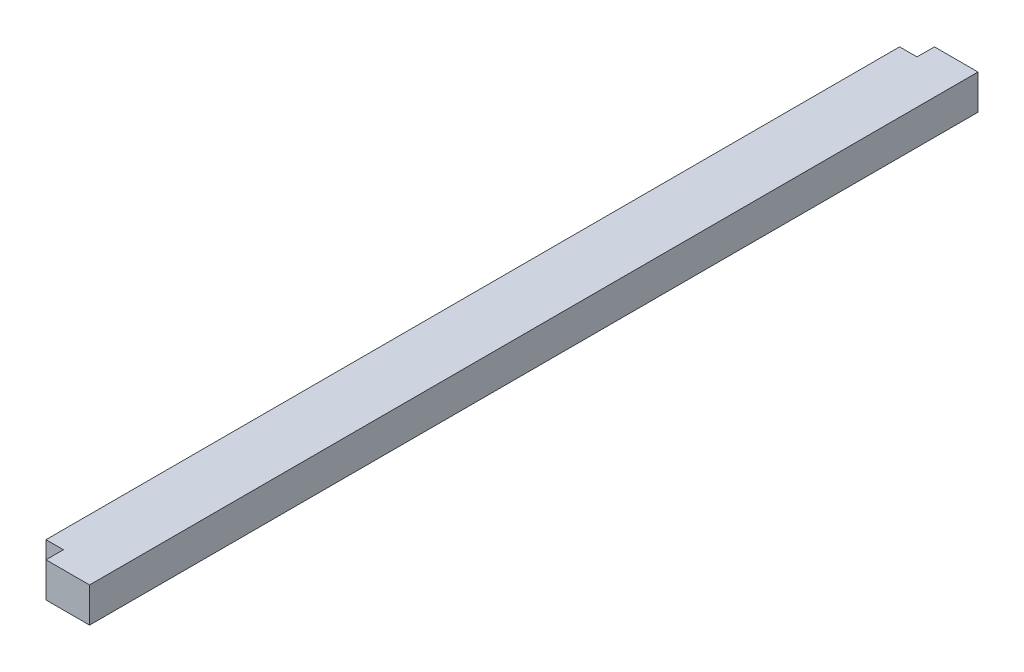
ISO-10303-21;
HEADER;
FILE_DESCRIPTION(('STEP AP214'),'2;1');
FILE_NAME('part.step','',(''),(''),'','','');
FILE_SCHEMA(('AUTOMOTIVE_DESIGN { 1 0 10303 214 1 1 1 1 }'));
ENDSEC;
DATA;
#1=APPLICATION_CONTEXT('core data for automotive mechanical design processes');
#2=APPLICATION_PROTOCOL_DEFINITION('international standard','automotive_design',2000,#1);
#3=PRODUCT_CONTEXT('',#1,'mechanical');
#4=PRODUCT('Part','Part','',(#3));
#5=PRODUCT_RELATED_PRODUCT_CATEGORY('part','',(#4));
#6=PRODUCT_DEFINITION_FORMATION('','',#4);
#7=PRODUCT_DEFINITION_CONTEXT('part definition',#1,'design');
#8=PRODUCT_DEFINITION('design','',#6,#7);
#9=PRODUCT_DEFINITION_SHAPE('','',#8);
#10=(LENGTH_UNIT() NAMED_UNIT(*) SI_UNIT(.MILLI.,.METRE.));
#11=(NAMED_UNIT(*) PLANE_ANGLE_UNIT() SI_UNIT($,.RADIAN.));
#12=(NAMED_UNIT(*) SI_UNIT($,.STERADIAN.) SOLID_ANGLE_UNIT());
#13=UNCERTAINTY_MEASURE_WITH_UNIT(LENGTH_MEASURE(1.E-05),#10,'distance_accuracy_value','');
#14=(GEOMETRIC_REPRESENTATION_CONTEXT(3) GLOBAL_UNCERTAINTY_ASSIGNED_CONTEXT((#13)) GLOBAL_UNIT_ASSIGNED_CONTEXT((#10,
#11,#12)) REPRESENTATION_CONTEXT('',''));
#15=CARTESIAN_POINT('',(0.,0.,0.));
#16=DIRECTION('',(0.,0.,1.));
#17=DIRECTION('',(1.,0.,0.));
#18=AXIS2_PLACEMENT_3D('',#15,#16,#17);
#19=CARTESIAN_POINT('',(0.,0.,-510.));
#20=DIRECTION('',(1.,0.,0.));
#21=DIRECTION('',(0.,0.,-1.));
#22=AXIS2_PLACEMENT_3D('',#19,#20,#21);
#23=PLANE('',#22);
#24=DIRECTION('',(0.,0.,1.));
#25=VECTOR('',#24,1.);
#26=CARTESIAN_POINT('',(0.,0.,-510.));
#27=LINE('',#26,#25);
#28=CARTESIAN_POINT('',(0.,0.,-500.));
#29=VERTEX_POINT('',#28);
#30=CARTESIAN_POINT('',(0.,0.,-10.));
#31=VERTEX_POINT('',#30);
#32=EDGE_CURVE('E117',#29,#31,#27,.T.);
#33=ORIENTED_EDGE('',*,*,#32,.F.);
#34=DIRECTION('',(0.,1.,0.));
#35=VECTOR('',#34,1.);
#36=CARTESIAN_POINT('',(0.,-20.,-500.));
#37=LINE('',#36,#35);
#38=CARTESIAN_POINT('',(0.,-10.,-500.));
#39=VERTEX_POINT('',#38);
#40=EDGE_CURVE('E103',#39,#29,#37,.T.);
#41=ORIENTED_EDGE('',*,*,#40,.F.);
#42=DIRECTION('',(0.,0.,1.));
#43=VECTOR('',#42,1.);
#44=CARTESIAN_POINT('',(0.,-10.,-510.));
#45=LINE('',#44,#43);
#46=CARTESIAN_POINT('',(0.,-10.,-10.));
#47=VERTEX_POINT('',#46);
#48=EDGE_CURVE('E135',#39,#47,#45,.T.);
#49=ORIENTED_EDGE('',*,*,#48,.T.);
#50=DIRECTION('',(0.,1.,0.));
#51=VECTOR('',#50,1.);
#52=CARTESIAN_POINT('',(0.,-20.,-10.));
#53=LINE('',#52,#51);
#54=EDGE_CURVE('E122',#47,#31,#53,.T.);
#55=ORIENTED_EDGE('',*,*,#54,.T.);
#56=EDGE_LOOP('',(#33,#41,#49,#55));
#57=FACE_BOUND('',#56,.T.);
#58=ADVANCED_FACE('F34',(#57),#23,.F.);
#59=CARTESIAN_POINT('',(0.,0.,-510.));
#60=DIRECTION('',(0.,-1.,0.));
#61=DIRECTION('',(0.,0.,-1.));
#62=AXIS2_PLACEMENT_3D('',#59,#60,#61);
#63=PLANE('',#62);
#64=DIRECTION('',(1.,0.,0.));
#65=VECTOR('',#64,1.);
#66=CARTESIAN_POINT('',(0.,0.,-510.));
#67=LINE('',#66,#65);
#68=CARTESIAN_POINT('',(10.,0.,-510.));
#69=VERTEX_POINT('',#68);
#70=CARTESIAN_POINT('',(35.,0.,-510.));
#71=VERTEX_POINT('',#70);
#72=EDGE_CURVE('E73',#69,#71,#67,.T.);
#73=ORIENTED_EDGE('',*,*,#72,.F.);
#74=DIRECTION('',(0.,0.,-1.));
#75=VECTOR('',#74,1.);
#76=CARTESIAN_POINT('',(10.,0.,-510.));
#77=LINE('',#76,#75);
#78=CARTESIAN_POINT('',(10.,0.,-500.));
#79=VERTEX_POINT('',#78);
#80=EDGE_CURVE('E112',#79,#69,#77,.T.);
#81=ORIENTED_EDGE('',*,*,#80,.F.);
#82=DIRECTION('',(1.,0.,0.));
#83=VECTOR('',#82,1.);
#84=CARTESIAN_POINT('',(0.,0.,-500.));
#85=LINE('',#84,#83);
#86=EDGE_CURVE('E106',#29,#79,#85,.T.);
#87=ORIENTED_EDGE('',*,*,#86,.F.);
#88=ORIENTED_EDGE('',*,*,#32,.T.);
#89=DIRECTION('',(-1.,0.,0.));
#90=VECTOR('',#89,1.);
#91=CARTESIAN_POINT('',(0.,0.,-10.));
#92=LINE('',#91,#90);
#93=CARTESIAN_POINT('',(10.,0.,-10.));
#94=VERTEX_POINT('',#93);
#95=EDGE_CURVE('E152',#94,#31,#92,.T.);
#96=ORIENTED_EDGE('',*,*,#95,.F.);
#97=DIRECTION('',(0.,0.,-1.));
#98=VECTOR('',#97,1.);
#99=CARTESIAN_POINT('',(10.,0.,0.));
#100=LINE('',#99,#98);
#101=CARTESIAN_POINT('',(10.,0.,0.));
#102=VERTEX_POINT('',#101);
#103=EDGE_CURVE('E155',#102,#94,#100,.T.);
#104=ORIENTED_EDGE('',*,*,#103,.F.);
#105=DIRECTION('',(1.,0.,0.));
#106=VECTOR('',#105,1.);
#107=CARTESIAN_POINT('',(0.,0.,0.));
#108=LINE('',#107,#106);
#109=CARTESIAN_POINT('',(35.,0.,0.));
#110=VERTEX_POINT('',#109);
#111=EDGE_CURVE('E143',#102,#110,#108,.T.);
#112=ORIENTED_EDGE('',*,*,#111,.T.);
#113=DIRECTION('',(0.,0.,1.));
#114=VECTOR('',#113,1.);
#115=CARTESIAN_POINT('',(35.,0.,-510.));
#116=LINE('',#115,#114);
#117=EDGE_CURVE('E123',#71,#110,#116,.T.);
#118=ORIENTED_EDGE('',*,*,#117,.F.);
#119=EDGE_LOOP('',(#73,#81,#87,#88,#96,#104,#112,#118));
#120=FACE_BOUND('',#119,.T.);
#121=ADVANCED_FACE('F115',(#120),#63,.F.);
#122=CARTESIAN_POINT('',(35.,0.,-510.));
#123=DIRECTION('',(-1.,0.,0.));
#124=DIRECTION('',(0.,0.,1.));
#125=AXIS2_PLACEMENT_3D('',#122,#123,#124);
#126=PLANE('',#125);
#127=DIRECTION('',(0.,-1.,0.));
#128=VECTOR('',#127,1.);
#129=CARTESIAN_POINT('',(35.,0.,0.));
#130=LINE('',#129,#128);
#131=CARTESIAN_POINT('',(35.,-20.,0.));
#132=VERTEX_POINT('',#131);
#133=EDGE_CURVE('E141',#110,#132,#130,.T.);
#134=ORIENTED_EDGE('',*,*,#133,.T.);
#135=DIRECTION('',(0.,0.,1.));
#136=VECTOR('',#135,1.);
#137=CARTESIAN_POINT('',(35.,-20.,-510.));
#138=LINE('',#137,#136);
#139=CARTESIAN_POINT('',(35.,-20.,-510.));
#140=VERTEX_POINT('',#139);
#141=EDGE_CURVE('E127',#140,#132,#138,.T.);
#142=ORIENTED_EDGE('',*,*,#141,.F.);
#143=DIRECTION('',(0.,-1.,0.));
#144=VECTOR('',#143,1.);
#145=CARTESIAN_POINT('',(35.,0.,-510.));
#146=LINE('',#145,#144);
#147=EDGE_CURVE('E147',#71,#140,#146,.T.);
#148=ORIENTED_EDGE('',*,*,#147,.F.);
#149=ORIENTED_EDGE('',*,*,#117,.T.);
#150=EDGE_LOOP('',(#134,#142,#148,#149));
#151=FACE_BOUND('',#150,.T.);
#152=ADVANCED_FACE('F167',(#151),#126,.F.);
#153=CARTESIAN_POINT('',(10.,-20.,-510.));
#154=DIRECTION('',(0.,1.,0.));
#155=DIRECTION('',(0.,0.,1.));
#156=AXIS2_PLACEMENT_3D('',#153,#154,#155);
#157=PLANE('',#156);
#158=DIRECTION('',(-1.,0.,0.));
#159=VECTOR('',#158,1.);
#160=CARTESIAN_POINT('',(10.,-20.,0.));
#161=LINE('',#160,#159);
#162=CARTESIAN_POINT('',(10.,-20.,0.));
#163=VERTEX_POINT('',#162);
#164=EDGE_CURVE('E139',#132,#163,#161,.T.);
#165=ORIENTED_EDGE('',*,*,#164,.T.);
#166=DIRECTION('',(0.,0.,1.));
#167=VECTOR('',#166,1.);
#168=CARTESIAN_POINT('',(10.,-20.,-510.));
#169=LINE('',#168,#167);
#170=CARTESIAN_POINT('',(10.,-20.,-510.));
#171=VERTEX_POINT('',#170);
#172=EDGE_CURVE('E70',#171,#163,#169,.T.);
#173=ORIENTED_EDGE('',*,*,#172,.F.);
#174=DIRECTION('',(-1.,0.,0.));
#175=VECTOR('',#174,1.);
#176=CARTESIAN_POINT('',(10.,-20.,-510.));
#177=LINE('',#176,#175);
#178=EDGE_CURVE('E54',#140,#171,#177,.T.);
#179=ORIENTED_EDGE('',*,*,#178,.F.);
#180=ORIENTED_EDGE('',*,*,#141,.T.);
#181=EDGE_LOOP('',(#165,#173,#179,#180));
#182=FACE_BOUND('',#181,.T.);
#183=ADVANCED_FACE('F190',(#182),#157,.F.);
#184=CARTESIAN_POINT('',(10.,-10.,-510.));
#185=DIRECTION('',(1.,0.,0.));
#186=DIRECTION('',(0.,0.,-1.));
#187=AXIS2_PLACEMENT_3D('',#184,#185,#186);
#188=PLANE('',#187);
#189=DIRECTION('',(0.,0.,1.));
#190=VECTOR('',#189,1.);
#191=CARTESIAN_POINT('',(10.,-10.,-510.));
#192=LINE('',#191,#190);
#193=CARTESIAN_POINT('',(10.,-10.,-500.));
#194=VERTEX_POINT('',#193);
#195=CARTESIAN_POINT('',(10.,-10.,-10.));
#196=VERTEX_POINT('',#195);
#197=EDGE_CURVE('E133',#194,#196,#192,.T.);
#198=ORIENTED_EDGE('',*,*,#197,.F.);
#199=DIRECTION('',(0.,1.,0.));
#200=VECTOR('',#199,1.);
#201=CARTESIAN_POINT('',(10.,-20.,-500.));
#202=LINE('',#201,#200);
#203=EDGE_CURVE('E111',#194,#79,#202,.T.);
#204=ORIENTED_EDGE('',*,*,#203,.T.);
#205=ORIENTED_EDGE('',*,*,#80,.T.);
#206=DIRECTION('',(0.,1.,0.));
#207=VECTOR('',#206,1.);
#208=CARTESIAN_POINT('',(10.,-10.,-510.));
#209=LINE('',#208,#207);
#210=EDGE_CURVE('E48',#171,#69,#209,.T.);
#211=ORIENTED_EDGE('',*,*,#210,.F.);
#212=ORIENTED_EDGE('',*,*,#172,.T.);
#213=DIRECTION('',(0.,1.,0.));
#214=VECTOR('',#213,1.);
#215=CARTESIAN_POINT('',(10.,-10.,0.));
#216=LINE('',#215,#214);
#217=EDGE_CURVE('E137',#163,#102,#216,.T.);
#218=ORIENTED_EDGE('',*,*,#217,.T.);
#219=ORIENTED_EDGE('',*,*,#103,.T.);
#220=DIRECTION('',(0.,1.,0.));
#221=VECTOR('',#220,1.);
#222=CARTESIAN_POINT('',(10.,-20.,-10.));
#223=LINE('',#222,#221);
#224=EDGE_CURVE('E150',#196,#94,#223,.T.);
#225=ORIENTED_EDGE('',*,*,#224,.F.);
#226=EDGE_LOOP('',(#198,#204,#205,#211,#212,#218,#219,#225));
#227=FACE_BOUND('',#226,.T.);
#228=ADVANCED_FACE('F160',(#227),#188,.F.);
#229=CARTESIAN_POINT('',(0.,-10.,-510.));
#230=DIRECTION('',(0.,1.,0.));
#231=DIRECTION('',(0.,0.,1.));
#232=AXIS2_PLACEMENT_3D('',#229,#230,#231);
#233=PLANE('',#232);
#234=ORIENTED_EDGE('',*,*,#48,.F.);
#235=DIRECTION('',(1.,0.,0.));
#236=VECTOR('',#235,1.);
#237=CARTESIAN_POINT('',(0.,-10.,-500.));
#238=LINE('',#237,#236);
#239=EDGE_CURVE('E11',#39,#194,#238,.T.);
#240=ORIENTED_EDGE('',*,*,#239,.T.);
#241=ORIENTED_EDGE('',*,*,#197,.T.);
#242=DIRECTION('',(-1.,0.,0.));
#243=VECTOR('',#242,1.);
#244=CARTESIAN_POINT('',(0.,-10.,-10.));
#245=LINE('',#244,#243);
#246=EDGE_CURVE('E41',#196,#47,#245,.T.);
#247=ORIENTED_EDGE('',*,*,#246,.T.);
#248=EDGE_LOOP('',(#234,#240,#241,#247));
#249=FACE_BOUND('',#248,.T.);
#250=ADVANCED_FACE('F171',(#249),#233,.F.);
#251=CARTESIAN_POINT('',(0.,0.,-510.));
#252=DIRECTION('',(0.,0.,1.));
#253=DIRECTION('',(1.,0.,0.));
#254=AXIS2_PLACEMENT_3D('',#251,#252,#253);
#255=PLANE('',#254);
#256=ORIENTED_EDGE('',*,*,#210,.T.);
#257=ORIENTED_EDGE('',*,*,#72,.T.);
#258=ORIENTED_EDGE('',*,*,#147,.T.);
#259=ORIENTED_EDGE('',*,*,#178,.T.);
#260=EDGE_LOOP('',(#256,#257,#258,#259));
#261=FACE_BOUND('',#260,.T.);
#262=ADVANCED_FACE('F168',(#261),#255,.F.);
#263=CARTESIAN_POINT('',(0.,0.,0.));
#264=DIRECTION('',(0.,0.,1.));
#265=DIRECTION('',(1.,0.,0.));
#266=AXIS2_PLACEMENT_3D('',#263,#264,#265);
#267=PLANE('',#266);
#268=ORIENTED_EDGE('',*,*,#111,.F.);
#269=ORIENTED_EDGE('',*,*,#217,.F.);
#270=ORIENTED_EDGE('',*,*,#164,.F.);
#271=ORIENTED_EDGE('',*,*,#133,.F.);
#272=EDGE_LOOP('',(#268,#269,#270,#271));
#273=FACE_BOUND('',#272,.T.);
#274=ADVANCED_FACE('F170',(#273),#267,.T.);
#275=CARTESIAN_POINT('',(0.,-20.,-10.));
#276=DIRECTION('',(0.,0.,-1.));
#277=DIRECTION('',(-1.,0.,0.));
#278=AXIS2_PLACEMENT_3D('',#275,#276,#277);
#279=PLANE('',#278);
#280=ORIENTED_EDGE('',*,*,#224,.T.);
#281=ORIENTED_EDGE('',*,*,#95,.T.);
#282=ORIENTED_EDGE('',*,*,#54,.F.);
#283=ORIENTED_EDGE('',*,*,#246,.F.);
#284=EDGE_LOOP('',(#280,#281,#282,#283));
#285=FACE_BOUND('',#284,.T.);
#286=ADVANCED_FACE('F177',(#285),#279,.F.);
#287=CARTESIAN_POINT('',(0.,-20.,-500.));
#288=DIRECTION('',(0.,0.,1.));
#289=DIRECTION('',(1.,0.,0.));
#290=AXIS2_PLACEMENT_3D('',#287,#288,#289);
#291=PLANE('',#290);
#292=ORIENTED_EDGE('',*,*,#40,.T.);
#293=ORIENTED_EDGE('',*,*,#86,.T.);
#294=ORIENTED_EDGE('',*,*,#203,.F.);
#295=ORIENTED_EDGE('',*,*,#239,.F.);
#296=EDGE_LOOP('',(#292,#293,#294,#295));
#297=FACE_BOUND('',#296,.T.);
#298=ADVANCED_FACE('F105',(#297),#291,.F.);
#299=CLOSED_SHELL('',(#58,#121,#152,#183,#228,#250,#262,#274,#286,#298));
#300=MANIFOLD_SOLID_BREP('B2',#299);
#301=ADVANCED_BREP_SHAPE_REPRESENTATION('',(#18,#300),#14);
#302=SHAPE_DEFINITION_REPRESENTATION(#9,#301);
ENDSEC;
END-ISO-10303-21;
